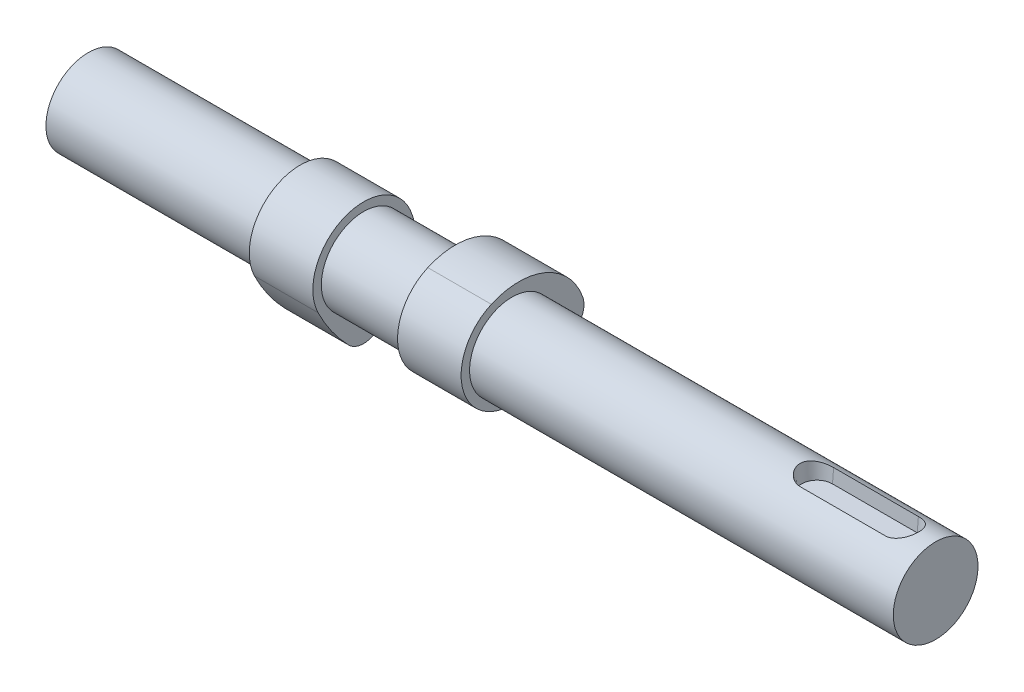
ISO-10303-21;
HEADER;
FILE_DESCRIPTION(('STEP AP214'),'2;1');
FILE_NAME('part.step','',(''),(''),'','','');
FILE_SCHEMA(('AUTOMOTIVE_DESIGN { 1 0 10303 214 1 1 1 1 }'));
ENDSEC;
DATA;
#1=APPLICATION_CONTEXT('core data for automotive mechanical design processes');
#2=APPLICATION_PROTOCOL_DEFINITION('international standard','automotive_design',2000,#1);
#3=PRODUCT_CONTEXT('',#1,'mechanical');
#4=PRODUCT('Part','Part','',(#3));
#5=PRODUCT_RELATED_PRODUCT_CATEGORY('part','',(#4));
#6=PRODUCT_DEFINITION_FORMATION('','',#4);
#7=PRODUCT_DEFINITION_CONTEXT('part definition',#1,'design');
#8=PRODUCT_DEFINITION('design','',#6,#7);
#9=PRODUCT_DEFINITION_SHAPE('','',#8);
#10=(LENGTH_UNIT() NAMED_UNIT(*) SI_UNIT(.MILLI.,.METRE.));
#11=(NAMED_UNIT(*) PLANE_ANGLE_UNIT() SI_UNIT($,.RADIAN.));
#12=(NAMED_UNIT(*) SI_UNIT($,.STERADIAN.) SOLID_ANGLE_UNIT());
#13=UNCERTAINTY_MEASURE_WITH_UNIT(LENGTH_MEASURE(1.E-05),#10,'distance_accuracy_value','');
#14=(GEOMETRIC_REPRESENTATION_CONTEXT(3) GLOBAL_UNCERTAINTY_ASSIGNED_CONTEXT((#13)) GLOBAL_UNIT_ASSIGNED_CONTEXT((#10,
#11,#12)) REPRESENTATION_CONTEXT('',''));
#15=CARTESIAN_POINT('',(0.,0.,0.));
#16=DIRECTION('',(0.,0.,1.));
#17=DIRECTION('',(1.,0.,0.));
#18=AXIS2_PLACEMENT_3D('',#15,#16,#17);
#19=CARTESIAN_POINT('',(-25.,-1.62236318948028,3.65621904177244));
#20=DIRECTION('',(1.,0.,0.));
#21=DIRECTION('',(0.,1.,0.));
#22=AXIS2_PLACEMENT_3D('',#19,#20,#21);
#23=CYLINDRICAL_SURFACE('',#22,16.);
#24=CARTESIAN_POINT('',(-10.,-1.62236318948028,3.65621904177244));
#25=DIRECTION('',(1.,0.,0.));
#26=DIRECTION('',(0.,1.,0.));
#27=AXIS2_PLACEMENT_3D('',#24,#25,#26);
#28=CIRCLE('',#27,16.);
#29=CARTESIAN_POINT('',(-10.,-16.7126720366766,-1.66191774626038));
#30=VERTEX_POINT('',#29);
#31=CARTESIAN_POINT('',(-10.,4.86708956844084,-10.9686571253173));
#32=VERTEX_POINT('',#31);
#33=EDGE_CURVE('E114',#30,#32,#28,.T.);
#34=ORIENTED_EDGE('',*,*,#33,.F.);
#35=DIRECTION('',(1.,0.,0.));
#36=VECTOR('',#35,1.);
#37=CARTESIAN_POINT('',(-25.,-16.7126720366766,-1.66191774626038));
#38=LINE('',#37,#36);
#39=CARTESIAN_POINT('',(-25.,-16.7126720366766,-1.66191774626038));
#40=VERTEX_POINT('',#39);
#41=EDGE_CURVE('E115',#40,#30,#38,.T.);
#42=ORIENTED_EDGE('',*,*,#41,.F.);
#43=CARTESIAN_POINT('',(-25.,-1.62236318948028,3.65621904177244));
#44=DIRECTION('',(1.,0.,0.));
#45=DIRECTION('',(0.,1.,0.));
#46=AXIS2_PLACEMENT_3D('',#43,#44,#45);
#47=CIRCLE('',#46,16.);
#48=CARTESIAN_POINT('',(-25.,4.86708956844084,-10.9686571253173));
#49=VERTEX_POINT('',#48);
#50=EDGE_CURVE('E110',#40,#49,#47,.T.);
#51=ORIENTED_EDGE('',*,*,#50,.T.);
#52=DIRECTION('',(1.,0.,0.));
#53=VECTOR('',#52,1.);
#54=CARTESIAN_POINT('',(-25.,4.86708956844084,-10.9686571253173));
#55=LINE('',#54,#53);
#56=EDGE_CURVE('E12',#49,#32,#55,.T.);
#57=ORIENTED_EDGE('',*,*,#56,.T.);
#58=EDGE_LOOP('',(#34,#42,#51,#57));
#59=FACE_BOUND('',#58,.T.);
#60=ADVANCED_FACE('F49',(#59),#23,.T.);
#61=CARTESIAN_POINT('',(-25.,0.,0.));
#62=DIRECTION('',(1.,0.,0.));
#63=DIRECTION('',(0.,1.,0.));
#64=AXIS2_PLACEMENT_3D('',#61,#62,#63);
#65=CYLINDRICAL_SURFACE('',#64,12.);
#66=CARTESIAN_POINT('',(-10.,0.,0.));
#67=DIRECTION('',(1.,0.,0.));
#68=DIRECTION('',(0.,-1.,0.));
#69=AXIS2_PLACEMENT_3D('',#66,#67,#68);
#70=CIRCLE('',#69,12.);
#71=CARTESIAN_POINT('',(-10.,-5.306226616829,10.7630831591536));
#72=VERTEX_POINT('',#71);
#73=EDGE_CURVE('E113',#32,#72,#70,.T.);
#74=ORIENTED_EDGE('',*,*,#73,.F.);
#75=ORIENTED_EDGE('',*,*,#56,.F.);
#76=CARTESIAN_POINT('',(-25.,0.,0.));
#77=DIRECTION('',(1.,0.,0.));
#78=DIRECTION('',(0.,-1.,0.));
#79=AXIS2_PLACEMENT_3D('',#76,#77,#78);
#80=CIRCLE('',#79,12.);
#81=CARTESIAN_POINT('',(-25.,-5.306226616829,10.7630831591536));
#82=VERTEX_POINT('',#81);
#83=EDGE_CURVE('E93',#49,#82,#80,.T.);
#84=ORIENTED_EDGE('',*,*,#83,.T.);
#85=DIRECTION('',(1.,0.,0.));
#86=VECTOR('',#85,1.);
#87=CARTESIAN_POINT('',(-25.,-5.306226616829,10.7630831591536));
#88=LINE('',#87,#86);
#89=EDGE_CURVE('E59',#82,#72,#88,.T.);
#90=ORIENTED_EDGE('',*,*,#89,.T.);
#91=EDGE_LOOP('',(#74,#75,#84,#90));
#92=FACE_BOUND('',#91,.T.);
#93=ADVANCED_FACE('F104',(#92),#65,.T.);
#94=CARTESIAN_POINT('',(-25.,12.3811954392677,-25.1138607046917));
#95=DIRECTION('',(1.,0.,0.));
#96=DIRECTION('',(0.,1.,0.));
#97=AXIS2_PLACEMENT_3D('',#94,#95,#96);
#98=CYLINDRICAL_SURFACE('',#97,40.);
#99=CARTESIAN_POINT('',(-10.,12.3811954392677,-25.1138607046917));
#100=DIRECTION('',(1.,0.,0.));
#101=DIRECTION('',(0.,-1.,0.));
#102=AXIS2_PLACEMENT_3D('',#99,#100,#101);
#103=CIRCLE('',#102,40.);
#104=CARTESIAN_POINT('',(-10.,-15.4795428020985,3.58769438638438));
#105=VERTEX_POINT('',#104);
#106=EDGE_CURVE('E101',#72,#105,#103,.T.);
#107=ORIENTED_EDGE('',*,*,#106,.F.);
#108=ORIENTED_EDGE('',*,*,#89,.F.);
#109=CARTESIAN_POINT('',(-25.,12.3811954392677,-25.1138607046917));
#110=DIRECTION('',(1.,0.,0.));
#111=DIRECTION('',(0.,-1.,0.));
#112=AXIS2_PLACEMENT_3D('',#109,#110,#111);
#113=CIRCLE('',#112,40.);
#114=CARTESIAN_POINT('',(-25.,-15.4795428020985,3.58769438638438));
#115=VERTEX_POINT('',#114);
#116=EDGE_CURVE('E94',#82,#115,#113,.T.);
#117=ORIENTED_EDGE('',*,*,#116,.T.);
#118=DIRECTION('',(1.,0.,0.));
#119=VECTOR('',#118,1.);
#120=CARTESIAN_POINT('',(-25.,-15.4795428020985,3.58769438638438));
#121=LINE('',#120,#119);
#122=EDGE_CURVE('E102',#115,#105,#121,.T.);
#123=ORIENTED_EDGE('',*,*,#122,.T.);
#124=EDGE_LOOP('',(#107,#108,#117,#123));
#125=FACE_BOUND('',#124,.T.);
#126=ADVANCED_FACE('F99',(#125),#98,.T.);
#127=CARTESIAN_POINT('',(-25.,-11.9969505219278,-1.25661386611005E-13));
#128=DIRECTION('',(1.,0.,0.));
#129=DIRECTION('',(0.,1.,0.));
#130=AXIS2_PLACEMENT_3D('',#127,#128,#129);
#131=CYLINDRICAL_SURFACE('',#130,5.);
#132=CARTESIAN_POINT('',(-10.,-11.9969505219278,-1.25661386611005E-13));
#133=DIRECTION('',(1.,0.,0.));
#134=DIRECTION('',(0.,1.,0.));
#135=AXIS2_PLACEMENT_3D('',#132,#133,#134);
#136=CIRCLE('',#135,5.);
#137=EDGE_CURVE('E77',#105,#30,#136,.T.);
#138=ORIENTED_EDGE('',*,*,#137,.F.);
#139=ORIENTED_EDGE('',*,*,#122,.F.);
#140=CARTESIAN_POINT('',(-25.,-11.9969505219278,-1.25661386611005E-13));
#141=DIRECTION('',(1.,0.,0.));
#142=DIRECTION('',(0.,1.,0.));
#143=AXIS2_PLACEMENT_3D('',#140,#141,#142);
#144=CIRCLE('',#143,5.);
#145=EDGE_CURVE('E67',#115,#40,#144,.T.);
#146=ORIENTED_EDGE('',*,*,#145,.T.);
#147=ORIENTED_EDGE('',*,*,#41,.T.);
#148=EDGE_LOOP('',(#138,#139,#146,#147));
#149=FACE_BOUND('',#148,.T.);
#150=ADVANCED_FACE('F121',(#149),#131,.T.);
#151=CARTESIAN_POINT('',(-25.,-6.80965685570402,1.82810952088616));
#152=DIRECTION('',(1.,0.,0.));
#153=DIRECTION('',(0.,1.,0.));
#154=AXIS2_PLACEMENT_3D('',#151,#152,#153);
#155=PLANE('',#154);
#156=ORIENTED_EDGE('',*,*,#50,.F.);
#157=ORIENTED_EDGE('',*,*,#145,.F.);
#158=ORIENTED_EDGE('',*,*,#116,.F.);
#159=ORIENTED_EDGE('',*,*,#83,.F.);
#160=EDGE_LOOP('',(#156,#157,#158,#159));
#161=FACE_BOUND('',#160,.T.);
#162=ADVANCED_FACE('F96',(#161),#155,.F.);
#163=CARTESIAN_POINT('',(-10.,-6.80965685570402,1.82810952088616));
#164=DIRECTION('',(1.,0.,0.));
#165=DIRECTION('',(0.,1.,0.));
#166=AXIS2_PLACEMENT_3D('',#163,#164,#165);
#167=PLANE('',#166);
#168=ORIENTED_EDGE('',*,*,#33,.T.);
#169=ORIENTED_EDGE('',*,*,#73,.T.);
#170=ORIENTED_EDGE('',*,*,#106,.T.);
#171=ORIENTED_EDGE('',*,*,#137,.T.);
#172=EDGE_LOOP('',(#168,#169,#170,#171));
#173=FACE_BOUND('',#172,.T.);
#174=ADVANCED_FACE('F117',(#173),#167,.T.);
#175=CLOSED_SHELL('',(#60,#93,#126,#150,#162,#174));
#176=MANIFOLD_SOLID_BREP('B2',#175);
#177=CARTESIAN_POINT('',(25.,-3.65621904177246,-1.62236318948024));
#178=DIRECTION('',(-1.,0.,0.));
#179=DIRECTION('',(0.,0.,1.));
#180=AXIS2_PLACEMENT_3D('',#177,#178,#179);
#181=CYLINDRICAL_SURFACE('',#180,16.);
#182=CARTESIAN_POINT('',(10.,-3.65621904177246,-1.62236318948024));
#183=DIRECTION('',(1.,0.,0.));
#184=DIRECTION('',(0.,0.,1.));
#185=AXIS2_PLACEMENT_3D('',#182,#183,#184);
#186=CIRCLE('',#185,16.);
#187=CARTESIAN_POINT('',(10.,1.66191774626021,-16.7126720366766));
#188=VERTEX_POINT('',#187);
#189=CARTESIAN_POINT('',(10.,10.9686571253174,4.86708956844072));
#190=VERTEX_POINT('',#189);
#191=EDGE_CURVE('E247',#188,#190,#186,.T.);
#192=ORIENTED_EDGE('',*,*,#191,.T.);
#193=DIRECTION('',(-1.,0.,0.));
#194=VECTOR('',#193,1.);
#195=CARTESIAN_POINT('',(25.,10.9686571253174,4.86708956844072));
#196=LINE('',#195,#194);
#197=CARTESIAN_POINT('',(25.,10.9686571253174,4.86708956844072));
#198=VERTEX_POINT('',#197);
#199=EDGE_CURVE('E48',#198,#190,#196,.T.);
#200=ORIENTED_EDGE('',*,*,#199,.F.);
#201=CARTESIAN_POINT('',(25.,-3.65621904177246,-1.62236318948024));
#202=DIRECTION('',(1.,0.,0.));
#203=DIRECTION('',(0.,0.,1.));
#204=AXIS2_PLACEMENT_3D('',#201,#202,#203);
#205=CIRCLE('',#204,16.);
#206=CARTESIAN_POINT('',(25.,1.66191774626021,-16.7126720366766));
#207=VERTEX_POINT('',#206);
#208=EDGE_CURVE('E231',#207,#198,#205,.T.);
#209=ORIENTED_EDGE('',*,*,#208,.F.);
#210=DIRECTION('',(-1.,0.,0.));
#211=VECTOR('',#210,1.);
#212=CARTESIAN_POINT('',(25.,1.66191774626021,-16.7126720366766));
#213=LINE('',#212,#211);
#214=EDGE_CURVE('E241',#207,#188,#213,.T.);
#215=ORIENTED_EDGE('',*,*,#214,.T.);
#216=EDGE_LOOP('',(#192,#200,#209,#215));
#217=FACE_BOUND('',#216,.T.);
#218=ADVANCED_FACE('F181',(#217),#181,.T.);
#219=CARTESIAN_POINT('',(25.,0.,0.));
#220=DIRECTION('',(-1.,0.,0.));
#221=DIRECTION('',(0.,0.,1.));
#222=AXIS2_PLACEMENT_3D('',#219,#220,#221);
#223=CYLINDRICAL_SURFACE('',#222,12.);
#224=CARTESIAN_POINT('',(10.,0.,0.));
#225=DIRECTION('',(1.,0.,0.));
#226=DIRECTION('',(0.,0.,-1.));
#227=AXIS2_PLACEMENT_3D('',#224,#225,#226);
#228=CIRCLE('',#227,12.);
#229=CARTESIAN_POINT('',(10.,-10.7630831591536,-5.30622661682889));
#230=VERTEX_POINT('',#229);
#231=EDGE_CURVE('E236',#190,#230,#228,.T.);
#232=ORIENTED_EDGE('',*,*,#231,.T.);
#233=DIRECTION('',(-1.,0.,0.));
#234=VECTOR('',#233,1.);
#235=CARTESIAN_POINT('',(25.,-10.7630831591536,-5.30622661682889));
#236=LINE('',#235,#234);
#237=CARTESIAN_POINT('',(25.,-10.7630831591536,-5.30622661682889));
#238=VERTEX_POINT('',#237);
#239=EDGE_CURVE('E192',#238,#230,#236,.T.);
#240=ORIENTED_EDGE('',*,*,#239,.F.);
#241=CARTESIAN_POINT('',(25.,0.,0.));
#242=DIRECTION('',(1.,0.,0.));
#243=DIRECTION('',(0.,0.,-1.));
#244=AXIS2_PLACEMENT_3D('',#241,#242,#243);
#245=CIRCLE('',#244,12.);
#246=EDGE_CURVE('E228',#198,#238,#245,.T.);
#247=ORIENTED_EDGE('',*,*,#246,.F.);
#248=ORIENTED_EDGE('',*,*,#199,.T.);
#249=EDGE_LOOP('',(#232,#240,#247,#248));
#250=FACE_BOUND('',#249,.T.);
#251=ADVANCED_FACE('F240',(#250),#223,.T.);
#252=CARTESIAN_POINT('',(25.,25.1138607046918,12.3811954392674));
#253=DIRECTION('',(-1.,0.,0.));
#254=DIRECTION('',(0.,0.,1.));
#255=AXIS2_PLACEMENT_3D('',#252,#253,#254);
#256=CYLINDRICAL_SURFACE('',#255,40.);
#257=CARTESIAN_POINT('',(10.,25.1138607046918,12.3811954392674));
#258=DIRECTION('',(1.,0.,0.));
#259=DIRECTION('',(0.,0.,-1.));
#260=AXIS2_PLACEMENT_3D('',#257,#258,#259);
#261=CIRCLE('',#260,40.);
#262=CARTESIAN_POINT('',(10.,-3.58769438638454,-15.4795428020985));
#263=VERTEX_POINT('',#262);
#264=EDGE_CURVE('E216',#230,#263,#261,.T.);
#265=ORIENTED_EDGE('',*,*,#264,.T.);
#266=DIRECTION('',(-1.,0.,0.));
#267=VECTOR('',#266,1.);
#268=CARTESIAN_POINT('',(25.,-3.58769438638454,-15.4795428020985));
#269=LINE('',#268,#267);
#270=CARTESIAN_POINT('',(25.,-3.58769438638454,-15.4795428020985));
#271=VERTEX_POINT('',#270);
#272=EDGE_CURVE('E239',#271,#263,#269,.T.);
#273=ORIENTED_EDGE('',*,*,#272,.F.);
#274=CARTESIAN_POINT('',(25.,25.1138607046918,12.3811954392674));
#275=DIRECTION('',(1.,0.,0.));
#276=DIRECTION('',(0.,0.,-1.));
#277=AXIS2_PLACEMENT_3D('',#274,#275,#276);
#278=CIRCLE('',#277,40.);
#279=EDGE_CURVE('E234',#238,#271,#278,.T.);
#280=ORIENTED_EDGE('',*,*,#279,.F.);
#281=ORIENTED_EDGE('',*,*,#239,.T.);
#282=EDGE_LOOP('',(#265,#273,#280,#281));
#283=FACE_BOUND('',#282,.T.);
#284=ADVANCED_FACE('F238',(#283),#256,.T.);
#285=CARTESIAN_POINT('',(25.,0.,-11.9969505219278));
#286=DIRECTION('',(-1.,0.,0.));
#287=DIRECTION('',(0.,0.,1.));
#288=AXIS2_PLACEMENT_3D('',#285,#286,#287);
#289=CYLINDRICAL_SURFACE('',#288,5.);
#290=CARTESIAN_POINT('',(10.,0.,-11.9969505219278));
#291=DIRECTION('',(1.,0.,0.));
#292=DIRECTION('',(0.,0.,1.));
#293=AXIS2_PLACEMENT_3D('',#290,#291,#292);
#294=CIRCLE('',#293,5.);
#295=EDGE_CURVE('E225',#263,#188,#294,.T.);
#296=ORIENTED_EDGE('',*,*,#295,.T.);
#297=ORIENTED_EDGE('',*,*,#214,.F.);
#298=CARTESIAN_POINT('',(25.,0.,-11.9969505219278));
#299=DIRECTION('',(1.,0.,0.));
#300=DIRECTION('',(0.,0.,1.));
#301=AXIS2_PLACEMENT_3D('',#298,#299,#300);
#302=CIRCLE('',#301,5.);
#303=EDGE_CURVE('E200',#271,#207,#302,.T.);
#304=ORIENTED_EDGE('',*,*,#303,.F.);
#305=ORIENTED_EDGE('',*,*,#272,.T.);
#306=EDGE_LOOP('',(#296,#297,#304,#305));
#307=FACE_BOUND('',#306,.T.);
#308=ADVANCED_FACE('F251',(#307),#289,.T.);
#309=CARTESIAN_POINT('',(25.,-1.82810952088623,-6.809656855704));
#310=DIRECTION('',(-1.,0.,0.));
#311=DIRECTION('',(0.,0.,1.));
#312=AXIS2_PLACEMENT_3D('',#309,#310,#311);
#313=PLANE('',#312);
#314=ORIENTED_EDGE('',*,*,#208,.T.);
#315=ORIENTED_EDGE('',*,*,#246,.T.);
#316=ORIENTED_EDGE('',*,*,#279,.T.);
#317=ORIENTED_EDGE('',*,*,#303,.T.);
#318=EDGE_LOOP('',(#314,#315,#316,#317));
#319=FACE_BOUND('',#318,.T.);
#320=ADVANCED_FACE('F227',(#319),#313,.F.);
#321=CARTESIAN_POINT('',(10.,-1.82810952088623,-6.809656855704));
#322=DIRECTION('',(-1.,0.,0.));
#323=DIRECTION('',(0.,0.,1.));
#324=AXIS2_PLACEMENT_3D('',#321,#322,#323);
#325=PLANE('',#324);
#326=ORIENTED_EDGE('',*,*,#191,.F.);
#327=ORIENTED_EDGE('',*,*,#295,.F.);
#328=ORIENTED_EDGE('',*,*,#264,.F.);
#329=ORIENTED_EDGE('',*,*,#231,.F.);
#330=EDGE_LOOP('',(#326,#327,#328,#329));
#331=FACE_BOUND('',#330,.T.);
#332=ADVANCED_FACE('F258',(#331),#325,.T.);
#333=CLOSED_SHELL('',(#218,#251,#284,#308,#320,#332));
#334=MANIFOLD_SOLID_BREP('B6',#333);
#335=CARTESIAN_POINT('',(-75.,0.,0.));
#336=DIRECTION('',(1.,0.,0.));
#337=DIRECTION('',(0.,0.,-1.));
#338=AXIS2_PLACEMENT_3D('',#335,#336,#337);
#339=CYLINDRICAL_SURFACE('',#338,10.);
#340=CARTESIAN_POINT('',(116.9998,9.19554732162667,3.92961950520972));
#341=CARTESIAN_POINT('',(117.108432526229,9.19552396461699,3.92963900895938));
#342=CARTESIAN_POINT('',(117.217054442407,9.19739790113637,3.92528821148888));
#343=CARTESIAN_POINT('',(117.433449189068,9.20478322107422,3.90795696349252));
#344=CARTESIAN_POINT('',(117.541222281507,9.21029343390919,3.89497929010512));
#345=CARTESIAN_POINT('',(117.754805249896,9.22477014169951,3.86056266999496));
#346=CARTESIAN_POINT('',(117.860620479704,9.23372503404509,3.83915212174359));
#347=CARTESIAN_POINT('',(118.069896437043,9.25479066145063,3.78808770588497));
#348=CARTESIAN_POINT('',(118.173357048389,9.26690155187349,3.75843343245227));
#349=CARTESIAN_POINT('',(118.478997114603,9.30741193624863,3.65751207972482));
#350=CARTESIAN_POINT('',(118.676801412905,9.34001597020544,3.57422665843843));
#351=CARTESIAN_POINT('',(119.055656727802,9.41272444967854,3.37809141880251));
#352=CARTESIAN_POINT('',(119.236694043575,9.45283494952219,3.26521770641159));
#353=CARTESIAN_POINT('',(119.586163210606,9.53832850590639,3.00660395270599));
#354=CARTESIAN_POINT('',(119.75359745749,9.58387103250205,2.85956460575029));
#355=CARTESIAN_POINT('',(120.06167183687,9.67365894564606,2.53928149200147));
#356=CARTESIAN_POINT('',(120.202307528385,9.7179041161741,2.36603339048636));
#357=CARTESIAN_POINT('',(120.455271105667,9.80118313396661,1.99346714637655));
#358=CARTESIAN_POINT('',(120.566978377658,9.8400954262747,1.79369791629398));
#359=CARTESIAN_POINT('',(120.754126120008,9.90710575454471,1.37616732968246));
#360=CARTESIAN_POINT('',(120.829586514252,9.93520972983523,1.15841593476275));
#361=CARTESIAN_POINT('',(120.937423647946,9.97586398416612,0.72555222212956));
#362=CARTESIAN_POINT('',(120.972183980034,9.98927144663287,0.511115107829934));
#363=CARTESIAN_POINT('',(121.005253036647,10.0020189726074,0.0790606490660713));
#364=CARTESIAN_POINT('',(121.003575139474,10.0013641990691,-0.138555498890742));
#365=CARTESIAN_POINT('',(120.965065772481,9.98653634618633,-0.557134377313778));
#366=CARTESIAN_POINT('',(120.930314495065,9.97316323800987,-0.758322063329798));
#367=CARTESIAN_POINT('',(120.830073130865,9.93541593559446,-1.15177617887117));
#368=CARTESIAN_POINT('',(120.764581003034,9.91104101089147,-1.34404201509667));
#369=CARTESIAN_POINT('',(120.603676754373,9.8530923067776,-1.71848117040826));
#370=CARTESIAN_POINT('',(120.50772071095,9.81935282430629,-1.90039390354835));
#371=CARTESIAN_POINT('',(120.289247885583,9.74606742103519,-2.246210811776));
#372=CARTESIAN_POINT('',(120.166721786218,9.70651946492988,-2.41010863904957));
#373=CARTESIAN_POINT('',(119.888474496445,9.62225347352947,-2.7278550736791));
#374=CARTESIAN_POINT('',(119.730991599461,9.57736844831364,-2.88011561690001));
#375=CARTESIAN_POINT('',(119.39269852426,9.48965886456742,-3.15714116902367));
#376=CARTESIAN_POINT('',(119.211877236817,9.44683530072072,-3.28189300651247));
#377=CARTESIAN_POINT('',(118.922606169477,9.38686542506334,-3.44824964477365));
#378=CARTESIAN_POINT('',(118.820957447824,9.36724202522513,-3.50106618947219));
#379=CARTESIAN_POINT('',(118.613181248028,9.33044058072898,-3.5979946757925));
#380=CARTESIAN_POINT('',(118.507055578203,9.31326156077457,-3.64211009185353));
#381=CARTESIAN_POINT('',(118.291154422689,9.28193522243321,-3.72122180241614));
#382=CARTESIAN_POINT('',(118.181382861742,9.26778475870701,-3.75622756608453));
#383=CARTESIAN_POINT('',(117.958933082548,9.24298582877054,-3.81684131432378));
#384=CARTESIAN_POINT('',(117.846256085105,9.23233591674958,-3.8424531793048));
#385=CARTESIAN_POINT('',(117.611930809076,9.21440060696265,-3.88528372873352));
#386=CARTESIAN_POINT('',(117.490152858103,9.20735840438907,-3.90189924806992));
#387=CARTESIAN_POINT('',(117.245519514609,9.19791466072453,-3.92407823700824));
#388=CARTESIAN_POINT('',(117.122665085282,9.19550932696913,-3.92965073920191));
#389=CARTESIAN_POINT('',(116.9998,9.19554732162667,-3.92961950520972));
#390=B_SPLINE_CURVE_WITH_KNOTS('',3,(#340,#341,#342,#343,#344,#345,#346,#347,#348,#349,#350,
#351,#352,#353,#354,#355,#356,#357,#358,#359,#360,#361,#362,#363,#364,#365,#366,#367,#368,#369,
#370,#371,#372,#373,#374,#375,#376,#377,#378,#379,#380,#381,#382,#383,#384,#385,#386,#387,#388,
#389),.UNSPECIFIED.,.F.,.F.,(4,2,2,2,2,2,2,2,2,2,2,2,2,2,2,2,2,2,2,2,2,2,2,2,4),(0.,
0.325775853756532,0.651446885464914,0.976030440919044,1.3006299779342,1.94872565760357,
2.59734632832017,3.27656669617222,3.9558995248008,4.64878303442881,5.34128524851461,
5.99080148182277,6.64007924914105,7.25104428619564,7.86204989415493,8.48464423808042,
9.10745726360786,9.77538752835235,10.4436369129641,10.7919327546046,11.1400892357431,
11.4878823615824,11.8355316596004,12.2042630896941,12.5726927926964),.UNSPECIFIED.);
#391=CARTESIAN_POINT('',(117.,9.19554731953007,3.92961951011584));
#392=VERTEX_POINT('',#391);
#393=CARTESIAN_POINT('',(117.,9.19554731953009,-3.92961951011584));
#394=VERTEX_POINT('',#393);
#395=EDGE_CURVE('E385',#392,#394,#390,.T.);
#396=ORIENTED_EDGE('',*,*,#395,.F.);
#397=DIRECTION('',(1.,0.,0.));
#398=VECTOR('',#397,1.);
#399=CARTESIAN_POINT('',(-75.,9.19554731953007,3.92961951011588));
#400=LINE('',#399,#398);
#401=CARTESIAN_POINT('',(97.,9.19554731953009,3.92961951011584));
#402=VERTEX_POINT('',#401);
#403=EDGE_CURVE('E182',#402,#392,#400,.T.);
#404=ORIENTED_EDGE('',*,*,#403,.F.);
#405=CARTESIAN_POINT('',(97.0002,9.19554732162667,-3.92961950520971));
#406=CARTESIAN_POINT('',(96.8915674737709,9.195523964617,-3.92963900895937));
#407=CARTESIAN_POINT('',(96.7829455575925,9.19739790113637,-3.92528821148888));
#408=CARTESIAN_POINT('',(96.5665508109321,9.20478322107422,-3.90795696349252));
#409=CARTESIAN_POINT('',(96.4587777184928,9.21029343390919,-3.89497929010511));
#410=CARTESIAN_POINT('',(96.2451947501037,9.22477014169951,-3.86056266999496));
#411=CARTESIAN_POINT('',(96.1393795202961,9.23372503404509,-3.83915212174359));
#412=CARTESIAN_POINT('',(95.9301035629571,9.25479066145063,-3.78808770588497));
#413=CARTESIAN_POINT('',(95.8266429516112,9.26690155187349,-3.75843343245227));
#414=CARTESIAN_POINT('',(95.5210028853967,9.30741193624864,-3.65751207972481));
#415=CARTESIAN_POINT('',(95.3231985870946,9.34001597020544,-3.57422665843843));
#416=CARTESIAN_POINT('',(94.9443432721979,9.41272444967854,-3.3780914188025));
#417=CARTESIAN_POINT('',(94.7633059564248,9.45283494952219,-3.26521770641159));
#418=CARTESIAN_POINT('',(94.413836789394,9.53832850590639,-3.00660395270598));
#419=CARTESIAN_POINT('',(94.2464025425101,9.58387103250205,-2.85956460575029));
#420=CARTESIAN_POINT('',(93.9383281631304,9.67365894564606,-2.53928149200146));
#421=CARTESIAN_POINT('',(93.7976924716152,9.7179041161741,-2.36603339048636));
#422=CARTESIAN_POINT('',(93.544728894333,9.80118313396661,-1.99346714637654));
#423=CARTESIAN_POINT('',(93.4330216223424,9.84009542627471,-1.79369791629397));
#424=CARTESIAN_POINT('',(93.2458738799919,9.90710575454472,-1.37616732968245));
#425=CARTESIAN_POINT('',(93.1704134857481,9.93520972983524,-1.15841593476274));
#426=CARTESIAN_POINT('',(93.0625763520545,9.97586398416612,-0.725552222129554));
#427=CARTESIAN_POINT('',(93.0278160199655,9.98927144663287,-0.511115107829929));
#428=CARTESIAN_POINT('',(92.9947469633532,10.0020189726074,-0.0790606490660663));
#429=CARTESIAN_POINT('',(92.9964248605263,10.0013641990691,0.138555498890747));
#430=CARTESIAN_POINT('',(93.0349342275193,9.98653634618633,0.557134377313783));
#431=CARTESIAN_POINT('',(93.0696855049347,9.97316323800987,0.758322063329803));
#432=CARTESIAN_POINT('',(93.1699268691349,9.93541593559446,1.15177617887117));
#433=CARTESIAN_POINT('',(93.2354189969656,9.91104101089147,1.34404201509667));
#434=CARTESIAN_POINT('',(93.3963232456273,9.8530923067776,1.71848117040827));
#435=CARTESIAN_POINT('',(93.4922792890503,9.81935282430629,1.90039390354836));
#436=CARTESIAN_POINT('',(93.7107521144166,9.74606742103519,2.24621081177601));
#437=CARTESIAN_POINT('',(93.8332782137822,9.70651946492988,2.41010863904958));
#438=CARTESIAN_POINT('',(94.1115255035547,9.62225347352947,2.7278550736791));
#439=CARTESIAN_POINT('',(94.2690084005388,9.57736844831364,2.88011561690001));
#440=CARTESIAN_POINT('',(94.6073014757403,9.48965886456742,3.15714116902367));
#441=CARTESIAN_POINT('',(94.7881227631832,9.44683530072072,3.28189300651247));
#442=CARTESIAN_POINT('',(95.0773938305227,9.38686542506334,3.44824964477365));
#443=CARTESIAN_POINT('',(95.1790425521757,9.36724202522513,3.5010661894722));
#444=CARTESIAN_POINT('',(95.386818751972,9.33044058072897,3.5979946757925));
#445=CARTESIAN_POINT('',(95.4929444217969,9.31326156077457,3.64211009185354));
#446=CARTESIAN_POINT('',(95.7088455773114,9.28193522243321,3.72122180241614));
#447=CARTESIAN_POINT('',(95.8186171382581,9.26778475870701,3.75622756608453));
#448=CARTESIAN_POINT('',(96.0410669174523,9.24298582877054,3.81684131432378));
#449=CARTESIAN_POINT('',(96.1537439148955,9.23233591674958,3.84245317930481));
#450=CARTESIAN_POINT('',(96.388069190924,9.21440060696265,3.88528372873352));
#451=CARTESIAN_POINT('',(96.5098471418972,9.20735840438907,3.90189924806992));
#452=CARTESIAN_POINT('',(96.7544804853914,9.19791466072453,3.92407823700824));
#453=CARTESIAN_POINT('',(96.8773349147178,9.19550932696913,3.92965073920191));
#454=CARTESIAN_POINT('',(97.0002,9.19554732162666,3.92961950520972));
#455=B_SPLINE_CURVE_WITH_KNOTS('',3,(#405,#406,#407,#408,#409,#410,#411,#412,#413,#414,#415,
#416,#417,#418,#419,#420,#421,#422,#423,#424,#425,#426,#427,#428,#429,#430,#431,#432,#433,#434,
#435,#436,#437,#438,#439,#440,#441,#442,#443,#444,#445,#446,#447,#448,#449,#450,#451,#452,#453,
#454),.UNSPECIFIED.,.F.,.F.,(4,2,2,2,2,2,2,2,2,2,2,2,2,2,2,2,2,2,2,2,2,2,2,2,4),(0.,
0.325775853756532,0.6514468854649,0.97603044091903,1.3006299779342,1.94872565760357,
2.59734632832017,3.27656669617222,3.9558995248008,4.64878303442882,5.34128524851461,
5.99080148182277,6.64007924914105,7.25104428619564,7.86204989415493,8.48464423808043,
9.10745726360786,9.77538752835233,10.443636912964,10.7919327546046,11.1400892357431,
11.4878823615824,11.8355316596004,12.2042630896941,12.5726927926964),.UNSPECIFIED.);
#456=CARTESIAN_POINT('',(97.,9.1955473195301,-3.92961951011584));
#457=VERTEX_POINT('',#456);
#458=EDGE_CURVE('E312',#457,#402,#455,.T.);
#459=ORIENTED_EDGE('',*,*,#458,.F.);
#460=DIRECTION('',(1.,0.,0.));
#461=VECTOR('',#460,1.);
#462=CARTESIAN_POINT('',(-75.,9.19554731953011,-3.92961951011579));
#463=LINE('',#462,#461);
#464=EDGE_CURVE('E353',#394,#457,#463,.F.);
#465=ORIENTED_EDGE('',*,*,#464,.F.);
#466=EDGE_LOOP('',(#396,#404,#459,#465));
#467=FACE_BOUND('',#466,.T.);
#468=CARTESIAN_POINT('',(-75.,0.,0.));
#469=DIRECTION('',(1.,0.,0.));
#470=DIRECTION('',(0.,0.,-1.));
#471=AXIS2_PLACEMENT_3D('',#468,#469,#470);
#472=CIRCLE('',#471,10.);
#473=CARTESIAN_POINT('',(-75.,0.,-10.));
#474=VERTEX_POINT('',#473);
#475=EDGE_CURVE('E377',#474,#474,#472,.T.);
#476=ORIENTED_EDGE('',*,*,#475,.T.);
#477=EDGE_LOOP('',(#476));
#478=FACE_BOUND('',#477,.T.);
#479=CARTESIAN_POINT('',(125.,0.,0.));
#480=DIRECTION('',(1.,0.,0.));
#481=DIRECTION('',(0.,0.,-1.));
#482=AXIS2_PLACEMENT_3D('',#479,#480,#481);
#483=CIRCLE('',#482,10.);
#484=CARTESIAN_POINT('',(125.,0.,-10.));
#485=VERTEX_POINT('',#484);
#486=EDGE_CURVE('E357',#485,#485,#483,.T.);
#487=ORIENTED_EDGE('',*,*,#486,.F.);
#488=EDGE_LOOP('',(#487));
#489=FACE_BOUND('',#488,.T.);
#490=ADVANCED_FACE('F307',(#467,#478,#489),#339,.T.);
#491=CARTESIAN_POINT('',(-75.,0.,0.));
#492=DIRECTION('',(1.,0.,0.));
#493=DIRECTION('',(0.,0.,-1.));
#494=AXIS2_PLACEMENT_3D('',#491,#492,#493);
#495=PLANE('',#494);
#496=ORIENTED_EDGE('',*,*,#475,.F.);
#497=EDGE_LOOP('',(#496));
#498=FACE_BOUND('',#497,.T.);
#499=ADVANCED_FACE('F402',(#498),#495,.F.);
#500=CARTESIAN_POINT('',(125.,0.,0.));
#501=DIRECTION('',(1.,0.,0.));
#502=DIRECTION('',(0.,0.,-1.));
#503=AXIS2_PLACEMENT_3D('',#500,#501,#502);
#504=PLANE('',#503);
#505=ORIENTED_EDGE('',*,*,#486,.T.);
#506=EDGE_LOOP('',(#505));
#507=FACE_BOUND('',#506,.T.);
#508=ADVANCED_FACE('F396',(#507),#504,.T.);
#509=CARTESIAN_POINT('',(97.,10.,0.));
#510=DIRECTION('',(0.,1.,0.));
#511=DIRECTION('',(0.,0.,1.));
#512=AXIS2_PLACEMENT_3D('',#509,#510,#511);
#513=CONICAL_SURFACE('',#512,4.,0.0872664625997167);
#514=DIRECTION('',(0.,0.996194698091745,-0.0871557427476584));
#515=VECTOR('',#514,1.);
#516=CARTESIAN_POINT('',(97.,10.,-4.));
#517=LINE('',#516,#515);
#518=CARTESIAN_POINT('',(97.,6.,-3.6500453458963));
#519=VERTEX_POINT('',#518);
#520=EDGE_CURVE('E346',#519,#457,#517,.T.);
#521=ORIENTED_EDGE('',*,*,#520,.T.);
#522=ORIENTED_EDGE('',*,*,#458,.T.);
#523=DIRECTION('',(0.,0.996194698091745,0.0871557427476584));
#524=VECTOR('',#523,1.);
#525=CARTESIAN_POINT('',(97.,10.,4.));
#526=LINE('',#525,#524);
#527=CARTESIAN_POINT('',(97.,6.,3.65004534589631));
#528=VERTEX_POINT('',#527);
#529=EDGE_CURVE('E321',#528,#402,#526,.T.);
#530=ORIENTED_EDGE('',*,*,#529,.F.);
#531=CARTESIAN_POINT('',(97.,6.,0.));
#532=DIRECTION('',(0.,1.,0.));
#533=DIRECTION('',(0.,0.,1.));
#534=AXIS2_PLACEMENT_3D('',#531,#532,#533);
#535=CIRCLE('',#534,3.6500453458963);
#536=EDGE_CURVE('E358',#519,#528,#535,.T.);
#537=ORIENTED_EDGE('',*,*,#536,.F.);
#538=EDGE_LOOP('',(#521,#522,#530,#537));
#539=FACE_BOUND('',#538,.T.);
#540=ADVANCED_FACE('F363',(#539),#513,.F.);
#541=CARTESIAN_POINT('',(97.,10.,-4.));
#542=DIRECTION('',(0.,-0.0871557427476584,-0.996194698091746));
#543=DIRECTION('',(0.,-0.996194698091746,0.0871557427476584));
#544=AXIS2_PLACEMENT_3D('',#541,#542,#543);
#545=PLANE('',#544);
#546=ORIENTED_EDGE('',*,*,#464,.T.);
#547=ORIENTED_EDGE('',*,*,#520,.F.);
#548=DIRECTION('',(-1.,0.,0.));
#549=VECTOR('',#548,1.);
#550=CARTESIAN_POINT('',(97.,6.,-3.6500453458963));
#551=LINE('',#550,#549);
#552=CARTESIAN_POINT('',(117.,6.,-3.6500453458963));
#553=VERTEX_POINT('',#552);
#554=EDGE_CURVE('E355',#553,#519,#551,.T.);
#555=ORIENTED_EDGE('',*,*,#554,.F.);
#556=DIRECTION('',(0.,0.996194698091745,-0.0871557427476584));
#557=VECTOR('',#556,1.);
#558=CARTESIAN_POINT('',(117.,10.,-4.));
#559=LINE('',#558,#557);
#560=EDGE_CURVE('E359',#553,#394,#559,.T.);
#561=ORIENTED_EDGE('',*,*,#560,.T.);
#562=EDGE_LOOP('',(#546,#547,#555,#561));
#563=FACE_BOUND('',#562,.T.);
#564=ADVANCED_FACE('F348',(#563),#545,.F.);
#565=CARTESIAN_POINT('',(117.,10.,0.));
#566=DIRECTION('',(0.,1.,0.));
#567=DIRECTION('',(0.,0.,1.));
#568=AXIS2_PLACEMENT_3D('',#565,#566,#567);
#569=CONICAL_SURFACE('',#568,4.,0.0872664625997167);
#570=DIRECTION('',(0.,0.996194698091745,0.0871557427476584));
#571=VECTOR('',#570,1.);
#572=CARTESIAN_POINT('',(117.,10.,4.));
#573=LINE('',#572,#571);
#574=CARTESIAN_POINT('',(117.,6.,3.6500453458963));
#575=VERTEX_POINT('',#574);
#576=EDGE_CURVE('E371',#575,#392,#573,.T.);
#577=ORIENTED_EDGE('',*,*,#576,.T.);
#578=ORIENTED_EDGE('',*,*,#395,.T.);
#579=ORIENTED_EDGE('',*,*,#560,.F.);
#580=CARTESIAN_POINT('',(117.,6.,0.));
#581=DIRECTION('',(0.,1.,0.));
#582=DIRECTION('',(0.,0.,1.));
#583=AXIS2_PLACEMENT_3D('',#580,#581,#582);
#584=CIRCLE('',#583,3.6500453458963);
#585=EDGE_CURVE('E369',#575,#553,#584,.T.);
#586=ORIENTED_EDGE('',*,*,#585,.F.);
#587=EDGE_LOOP('',(#577,#578,#579,#586));
#588=FACE_BOUND('',#587,.T.);
#589=ADVANCED_FACE('F386',(#588),#569,.F.);
#590=CARTESIAN_POINT('',(97.,10.,4.));
#591=DIRECTION('',(0.,-0.0871557427476584,0.996194698091746));
#592=DIRECTION('',(0.,-0.996194698091746,-0.0871557427476584));
#593=AXIS2_PLACEMENT_3D('',#590,#591,#592);
#594=PLANE('',#593);
#595=ORIENTED_EDGE('',*,*,#403,.T.);
#596=ORIENTED_EDGE('',*,*,#576,.F.);
#597=DIRECTION('',(1.,0.,0.));
#598=VECTOR('',#597,1.);
#599=CARTESIAN_POINT('',(97.,6.,3.65004534589631));
#600=LINE('',#599,#598);
#601=EDGE_CURVE('E365',#528,#575,#600,.T.);
#602=ORIENTED_EDGE('',*,*,#601,.F.);
#603=ORIENTED_EDGE('',*,*,#529,.T.);
#604=EDGE_LOOP('',(#595,#596,#602,#603));
#605=FACE_BOUND('',#604,.T.);
#606=ADVANCED_FACE('F393',(#605),#594,.F.);
#607=CARTESIAN_POINT('',(97.,6.,0.));
#608=DIRECTION('',(0.,1.,0.));
#609=DIRECTION('',(0.,0.,1.));
#610=AXIS2_PLACEMENT_3D('',#607,#608,#609);
#611=PLANE('',#610);
#612=ORIENTED_EDGE('',*,*,#536,.T.);
#613=ORIENTED_EDGE('',*,*,#601,.T.);
#614=ORIENTED_EDGE('',*,*,#585,.T.);
#615=ORIENTED_EDGE('',*,*,#554,.T.);
#616=EDGE_LOOP('',(#612,#613,#614,#615));
#617=FACE_BOUND('',#616,.T.);
#618=ADVANCED_FACE('F370',(#617),#611,.T.);
#619=CLOSED_SHELL('',(#490,#499,#508,#540,#564,#589,#606,#618));
#620=MANIFOLD_SOLID_BREP('B45',#619);
#621=ADVANCED_BREP_SHAPE_REPRESENTATION('',(#18,#176,#334,#620),#14);
#622=SHAPE_DEFINITION_REPRESENTATION(#9,#621);
ENDSEC;
END-ISO-10303-21;
